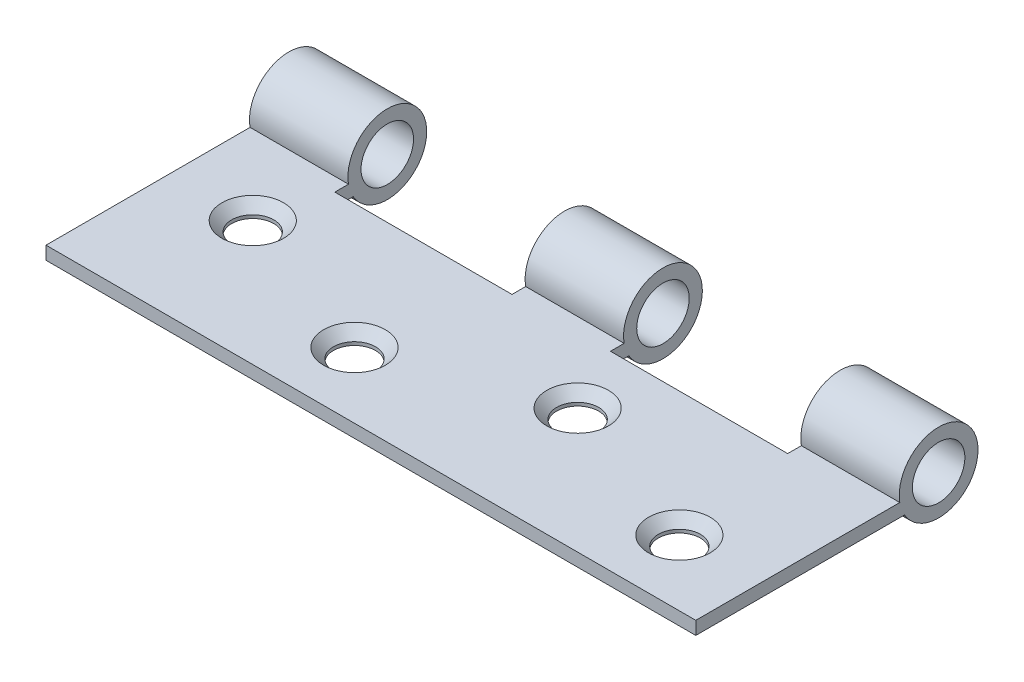
ISO-10303-21;
HEADER;
FILE_DESCRIPTION(('STEP AP214'),'2;1');
FILE_NAME('part.step','',(''),(''),'','','');
FILE_SCHEMA(('AUTOMOTIVE_DESIGN { 1 0 10303 214 1 1 1 1 }'));
ENDSEC;
DATA;
#1=APPLICATION_CONTEXT('core data for automotive mechanical design processes');
#2=APPLICATION_PROTOCOL_DEFINITION('international standard','automotive_design',2000,#1);
#3=PRODUCT_CONTEXT('',#1,'mechanical');
#4=PRODUCT('Part','Part','',(#3));
#5=PRODUCT_RELATED_PRODUCT_CATEGORY('part','',(#4));
#6=PRODUCT_DEFINITION_FORMATION('','',#4);
#7=PRODUCT_DEFINITION_CONTEXT('part definition',#1,'design');
#8=PRODUCT_DEFINITION('design','',#6,#7);
#9=PRODUCT_DEFINITION_SHAPE('','',#8);
#10=(LENGTH_UNIT() NAMED_UNIT(*) SI_UNIT(.MILLI.,.METRE.));
#11=(NAMED_UNIT(*) PLANE_ANGLE_UNIT() SI_UNIT($,.RADIAN.));
#12=(NAMED_UNIT(*) SI_UNIT($,.STERADIAN.) SOLID_ANGLE_UNIT());
#13=UNCERTAINTY_MEASURE_WITH_UNIT(LENGTH_MEASURE(1.E-05),#10,'distance_accuracy_value','');
#14=(GEOMETRIC_REPRESENTATION_CONTEXT(3) GLOBAL_UNCERTAINTY_ASSIGNED_CONTEXT((#13)) GLOBAL_UNIT_ASSIGNED_CONTEXT((#10,
#11,#12)) REPRESENTATION_CONTEXT('',''));
#15=CARTESIAN_POINT('',(0.,0.,0.));
#16=DIRECTION('',(0.,0.,1.));
#17=DIRECTION('',(1.,0.,0.));
#18=AXIS2_PLACEMENT_3D('',#15,#16,#17);
#19=CARTESIAN_POINT('',(99.,0.,0.));
#20=DIRECTION('',(-1.,0.,0.));
#21=DIRECTION('',(0.,0.,1.));
#22=AXIS2_PLACEMENT_3D('',#19,#20,#21);
#23=CYLINDRICAL_SURFACE('',#22,4.);
#24=CARTESIAN_POINT('',(84.,0.,0.));
#25=DIRECTION('',(1.,0.,0.));
#26=DIRECTION('',(0.,0.,-1.));
#27=AXIS2_PLACEMENT_3D('',#24,#25,#26);
#28=CIRCLE('',#27,4.);
#29=CARTESIAN_POINT('',(84.,0.,-4.));
#30=VERTEX_POINT('',#29);
#31=EDGE_CURVE('E153',#30,#30,#28,.T.);
#32=ORIENTED_EDGE('',*,*,#31,.F.);
#33=EDGE_LOOP('',(#32));
#34=FACE_BOUND('',#33,.T.);
#35=CARTESIAN_POINT('',(99.,0.,0.));
#36=DIRECTION('',(1.,0.,0.));
#37=DIRECTION('',(0.,0.,-1.));
#38=AXIS2_PLACEMENT_3D('',#35,#36,#37);
#39=CIRCLE('',#38,4.);
#40=CARTESIAN_POINT('',(99.,0.,-4.));
#41=VERTEX_POINT('',#40);
#42=EDGE_CURVE('E209',#41,#41,#39,.T.);
#43=ORIENTED_EDGE('',*,*,#42,.T.);
#44=EDGE_LOOP('',(#43));
#45=FACE_BOUND('',#44,.T.);
#46=ADVANCED_FACE('F33',(#34,#45),#23,.F.);
#47=CARTESIAN_POINT('',(99.,0.,0.));
#48=DIRECTION('',(-1.,0.,0.));
#49=DIRECTION('',(0.,0.,1.));
#50=AXIS2_PLACEMENT_3D('',#47,#48,#49);
#51=CYLINDRICAL_SURFACE('',#50,6.);
#52=CARTESIAN_POINT('',(57.,0.,0.));
#53=DIRECTION('',(-1.,0.,0.));
#54=DIRECTION('',(0.,0.,1.));
#55=AXIS2_PLACEMENT_3D('',#52,#53,#54);
#56=CIRCLE('',#55,6.);
#57=CARTESIAN_POINT('',(57.,-1.,5.91607978309962));
#58=VERTEX_POINT('',#57);
#59=CARTESIAN_POINT('',(57.,-3.00000000000001,5.19615242270663));
#60=VERTEX_POINT('',#59);
#61=EDGE_CURVE('E124',#58,#60,#56,.T.);
#62=ORIENTED_EDGE('',*,*,#61,.T.);
#63=DIRECTION('',(-1.,0.,0.));
#64=VECTOR('',#63,1.);
#65=CARTESIAN_POINT('',(99.,-3.,5.19615242270663));
#66=LINE('',#65,#64);
#67=CARTESIAN_POINT('',(42.,-3.00000000000001,5.19615242270663));
#68=VERTEX_POINT('',#67);
#69=EDGE_CURVE('E204',#68,#60,#66,.F.);
#70=ORIENTED_EDGE('',*,*,#69,.F.);
#71=CARTESIAN_POINT('',(42.,0.,0.));
#72=DIRECTION('',(1.,0.,0.));
#73=DIRECTION('',(0.,0.,-1.));
#74=AXIS2_PLACEMENT_3D('',#71,#72,#73);
#75=CIRCLE('',#74,6.);
#76=CARTESIAN_POINT('',(42.,-1.,5.91607978309962));
#77=VERTEX_POINT('',#76);
#78=EDGE_CURVE('E171',#68,#77,#75,.T.);
#79=ORIENTED_EDGE('',*,*,#78,.T.);
#80=DIRECTION('',(-1.,0.,0.));
#81=VECTOR('',#80,1.);
#82=CARTESIAN_POINT('',(99.,-1.,5.91607978309962));
#83=LINE('',#82,#81);
#84=EDGE_CURVE('E208',#58,#77,#83,.T.);
#85=ORIENTED_EDGE('',*,*,#84,.F.);
#86=EDGE_LOOP('',(#62,#70,#79,#85));
#87=FACE_BOUND('',#86,.T.);
#88=ADVANCED_FACE('F278',(#87),#51,.T.);
#89=CARTESIAN_POINT('',(15.,0.,0.));
#90=DIRECTION('',(-1.,0.,0.));
#91=DIRECTION('',(0.,0.,1.));
#92=AXIS2_PLACEMENT_3D('',#89,#90,#91);
#93=CIRCLE('',#92,6.);
#94=CARTESIAN_POINT('',(15.,-1.,5.91607978309962));
#95=VERTEX_POINT('',#94);
#96=CARTESIAN_POINT('',(15.,-3.00000000000001,5.19615242270663));
#97=VERTEX_POINT('',#96);
#98=EDGE_CURVE('E159',#95,#97,#93,.T.);
#99=ORIENTED_EDGE('',*,*,#98,.T.);
#100=CARTESIAN_POINT('',(0.,-3.00000000000001,5.19615242270663));
#101=VERTEX_POINT('',#100);
#102=EDGE_CURVE('E200',#101,#97,#66,.F.);
#103=ORIENTED_EDGE('',*,*,#102,.F.);
#104=CARTESIAN_POINT('',(0.,0.,0.));
#105=DIRECTION('',(1.,0.,0.));
#106=DIRECTION('',(0.,0.,-1.));
#107=AXIS2_PLACEMENT_3D('',#104,#105,#106);
#108=CIRCLE('',#107,6.);
#109=CARTESIAN_POINT('',(0.,-1.,5.91607978309962));
#110=VERTEX_POINT('',#109);
#111=EDGE_CURVE('E212',#101,#110,#108,.T.);
#112=ORIENTED_EDGE('',*,*,#111,.T.);
#113=EDGE_CURVE('E203',#95,#110,#83,.T.);
#114=ORIENTED_EDGE('',*,*,#113,.F.);
#115=EDGE_LOOP('',(#99,#103,#112,#114));
#116=FACE_BOUND('',#115,.T.);
#117=ADVANCED_FACE('F286',(#116),#51,.T.);
#118=CARTESIAN_POINT('',(57.,0.,0.));
#119=DIRECTION('',(-1.,0.,0.));
#120=DIRECTION('',(0.,0.,1.));
#121=AXIS2_PLACEMENT_3D('',#118,#119,#120);
#122=CIRCLE('',#121,4.);
#123=CARTESIAN_POINT('',(57.,0.,4.));
#124=VERTEX_POINT('',#123);
#125=EDGE_CURVE('E128',#124,#124,#122,.T.);
#126=ORIENTED_EDGE('',*,*,#125,.F.);
#127=EDGE_LOOP('',(#126));
#128=FACE_BOUND('',#127,.T.);
#129=CARTESIAN_POINT('',(42.,0.,0.));
#130=DIRECTION('',(1.,0.,0.));
#131=DIRECTION('',(0.,0.,-1.));
#132=AXIS2_PLACEMENT_3D('',#129,#130,#131);
#133=CIRCLE('',#132,4.);
#134=CARTESIAN_POINT('',(42.,0.,-4.));
#135=VERTEX_POINT('',#134);
#136=EDGE_CURVE('E177',#135,#135,#133,.T.);
#137=ORIENTED_EDGE('',*,*,#136,.F.);
#138=EDGE_LOOP('',(#137));
#139=FACE_BOUND('',#138,.T.);
#140=ADVANCED_FACE('F281',(#128,#139),#23,.F.);
#141=CARTESIAN_POINT('',(84.,-3.,5.19615242270663));
#142=VERTEX_POINT('',#141);
#143=CARTESIAN_POINT('',(99.,-3.,5.19615242270663));
#144=VERTEX_POINT('',#143);
#145=EDGE_CURVE('E199',#142,#144,#66,.F.);
#146=ORIENTED_EDGE('',*,*,#145,.F.);
#147=CARTESIAN_POINT('',(84.,0.,0.));
#148=DIRECTION('',(1.,0.,0.));
#149=DIRECTION('',(0.,0.,-1.));
#150=AXIS2_PLACEMENT_3D('',#147,#148,#149);
#151=CIRCLE('',#150,6.);
#152=CARTESIAN_POINT('',(84.,-1.,5.91607978309962));
#153=VERTEX_POINT('',#152);
#154=EDGE_CURVE('E145',#142,#153,#151,.T.);
#155=ORIENTED_EDGE('',*,*,#154,.T.);
#156=CARTESIAN_POINT('',(99.,-1.,5.91607978309962));
#157=VERTEX_POINT('',#156);
#158=EDGE_CURVE('E205',#157,#153,#83,.T.);
#159=ORIENTED_EDGE('',*,*,#158,.F.);
#160=CARTESIAN_POINT('',(99.,0.,0.));
#161=DIRECTION('',(1.,0.,0.));
#162=DIRECTION('',(0.,0.,-1.));
#163=AXIS2_PLACEMENT_3D('',#160,#161,#162);
#164=CIRCLE('',#163,6.);
#165=EDGE_CURVE('E215',#144,#157,#164,.T.);
#166=ORIENTED_EDGE('',*,*,#165,.F.);
#167=EDGE_LOOP('',(#146,#155,#159,#166));
#168=FACE_BOUND('',#167,.T.);
#169=ADVANCED_FACE('F289',(#168),#51,.T.);
#170=CARTESIAN_POINT('',(15.,0.,0.));
#171=DIRECTION('',(-1.,0.,0.));
#172=DIRECTION('',(0.,0.,1.));
#173=AXIS2_PLACEMENT_3D('',#170,#171,#172);
#174=CIRCLE('',#173,4.);
#175=CARTESIAN_POINT('',(15.,0.,4.));
#176=VERTEX_POINT('',#175);
#177=EDGE_CURVE('E165',#176,#176,#174,.T.);
#178=ORIENTED_EDGE('',*,*,#177,.F.);
#179=EDGE_LOOP('',(#178));
#180=FACE_BOUND('',#179,.T.);
#181=CARTESIAN_POINT('',(0.,0.,0.));
#182=DIRECTION('',(1.,0.,0.));
#183=DIRECTION('',(0.,0.,-1.));
#184=AXIS2_PLACEMENT_3D('',#181,#182,#183);
#185=CIRCLE('',#184,4.);
#186=CARTESIAN_POINT('',(0.,0.,-4.));
#187=VERTEX_POINT('',#186);
#188=EDGE_CURVE('E207',#187,#187,#185,.T.);
#189=ORIENTED_EDGE('',*,*,#188,.F.);
#190=EDGE_LOOP('',(#189));
#191=FACE_BOUND('',#190,.T.);
#192=ADVANCED_FACE('F282',(#180,#191),#23,.F.);
#193=CARTESIAN_POINT('',(99.,0.,0.));
#194=DIRECTION('',(1.,0.,0.));
#195=DIRECTION('',(0.,0.,-1.));
#196=AXIS2_PLACEMENT_3D('',#193,#194,#195);
#197=PLANE('',#196);
#198=ORIENTED_EDGE('',*,*,#42,.F.);
#199=EDGE_LOOP('',(#198));
#200=FACE_BOUND('',#199,.T.);
#201=ORIENTED_EDGE('',*,*,#165,.T.);
#202=DIRECTION('',(0.,0.,-1.));
#203=VECTOR('',#202,1.);
#204=CARTESIAN_POINT('',(99.,-1.,37.));
#205=LINE('',#204,#203);
#206=CARTESIAN_POINT('',(99.,-1.,37.));
#207=VERTEX_POINT('',#206);
#208=EDGE_CURVE('E189',#207,#157,#205,.T.);
#209=ORIENTED_EDGE('',*,*,#208,.F.);
#210=DIRECTION('',(0.,1.,0.));
#211=VECTOR('',#210,1.);
#212=CARTESIAN_POINT('',(99.,-1.,37.));
#213=LINE('',#212,#211);
#214=CARTESIAN_POINT('',(99.,-3.,37.));
#215=VERTEX_POINT('',#214);
#216=EDGE_CURVE('E187',#215,#207,#213,.T.);
#217=ORIENTED_EDGE('',*,*,#216,.F.);
#218=DIRECTION('',(0.,0.,-1.));
#219=VECTOR('',#218,1.);
#220=CARTESIAN_POINT('',(99.,-3.,37.));
#221=LINE('',#220,#219);
#222=EDGE_CURVE('E191',#215,#144,#221,.T.);
#223=ORIENTED_EDGE('',*,*,#222,.T.);
#224=EDGE_LOOP('',(#201,#209,#217,#223));
#225=FACE_BOUND('',#224,.T.);
#226=ADVANCED_FACE('F296',(#200,#225),#197,.T.);
#227=CARTESIAN_POINT('',(0.,0.,0.));
#228=DIRECTION('',(1.,0.,0.));
#229=DIRECTION('',(0.,0.,-1.));
#230=AXIS2_PLACEMENT_3D('',#227,#228,#229);
#231=PLANE('',#230);
#232=ORIENTED_EDGE('',*,*,#188,.T.);
#233=EDGE_LOOP('',(#232));
#234=FACE_BOUND('',#233,.T.);
#235=DIRECTION('',(0.,0.,-1.));
#236=VECTOR('',#235,1.);
#237=CARTESIAN_POINT('',(0.,-1.,37.));
#238=LINE('',#237,#236);
#239=CARTESIAN_POINT('',(0.,-1.,37.));
#240=VERTEX_POINT('',#239);
#241=EDGE_CURVE('E196',#240,#110,#238,.T.);
#242=ORIENTED_EDGE('',*,*,#241,.T.);
#243=ORIENTED_EDGE('',*,*,#111,.F.);
#244=DIRECTION('',(0.,0.,-1.));
#245=VECTOR('',#244,1.);
#246=CARTESIAN_POINT('',(0.,-3.00000000000001,37.));
#247=LINE('',#246,#245);
#248=CARTESIAN_POINT('',(0.,-3.00000000000001,37.));
#249=VERTEX_POINT('',#248);
#250=EDGE_CURVE('E194',#249,#101,#247,.T.);
#251=ORIENTED_EDGE('',*,*,#250,.F.);
#252=DIRECTION('',(0.,-1.,0.));
#253=VECTOR('',#252,1.);
#254=CARTESIAN_POINT('',(0.,-1.,37.));
#255=LINE('',#254,#253);
#256=EDGE_CURVE('E183',#240,#249,#255,.T.);
#257=ORIENTED_EDGE('',*,*,#256,.F.);
#258=EDGE_LOOP('',(#242,#243,#251,#257));
#259=FACE_BOUND('',#258,.T.);
#260=ADVANCED_FACE('F267',(#234,#259),#231,.F.);
#261=CARTESIAN_POINT('',(0.,-1.,37.));
#262=DIRECTION('',(0.,-1.,0.));
#263=DIRECTION('',(0.,0.,-1.));
#264=AXIS2_PLACEMENT_3D('',#261,#262,#263);
#265=PLANE('',#264);
#266=CARTESIAN_POINT('',(86.5,-1.,27.));
#267=DIRECTION('',(0.,-1.,0.));
#268=DIRECTION('',(0.,0.,-1.));
#269=AXIS2_PLACEMENT_3D('',#266,#267,#268);
#270=CIRCLE('',#269,4.69999999999997);
#271=CARTESIAN_POINT('',(86.5,-1.,22.3));
#272=VERTEX_POINT('',#271);
#273=EDGE_CURVE('E244',#272,#272,#270,.T.);
#274=ORIENTED_EDGE('',*,*,#273,.T.);
#275=EDGE_LOOP('',(#274));
#276=FACE_BOUND('',#275,.T.);
#277=CARTESIAN_POINT('',(62.,-1.,18.));
#278=DIRECTION('',(0.,-1.,0.));
#279=DIRECTION('',(0.,0.,-1.));
#280=AXIS2_PLACEMENT_3D('',#277,#278,#279);
#281=CIRCLE('',#280,4.69999999999996);
#282=CARTESIAN_POINT('',(62.,-1.,13.3));
#283=VERTEX_POINT('',#282);
#284=EDGE_CURVE('E241',#283,#283,#281,.T.);
#285=ORIENTED_EDGE('',*,*,#284,.T.);
#286=EDGE_LOOP('',(#285));
#287=FACE_BOUND('',#286,.T.);
#288=CARTESIAN_POINT('',(37.,-1.,27.));
#289=DIRECTION('',(0.,-1.,0.));
#290=DIRECTION('',(0.,0.,-1.));
#291=AXIS2_PLACEMENT_3D('',#288,#289,#290);
#292=CIRCLE('',#291,4.69999999999997);
#293=CARTESIAN_POINT('',(37.,-1.,22.3));
#294=VERTEX_POINT('',#293);
#295=EDGE_CURVE('E238',#294,#294,#292,.T.);
#296=ORIENTED_EDGE('',*,*,#295,.T.);
#297=EDGE_LOOP('',(#296));
#298=FACE_BOUND('',#297,.T.);
#299=CARTESIAN_POINT('',(12.5,-1.,18.));
#300=DIRECTION('',(0.,-1.,0.));
#301=DIRECTION('',(0.,0.,-1.));
#302=AXIS2_PLACEMENT_3D('',#299,#300,#301);
#303=CIRCLE('',#302,4.69999999999997);
#304=CARTESIAN_POINT('',(12.5,-1.,13.3));
#305=VERTEX_POINT('',#304);
#306=EDGE_CURVE('E235',#305,#305,#303,.T.);
#307=ORIENTED_EDGE('',*,*,#306,.T.);
#308=EDGE_LOOP('',(#307));
#309=FACE_BOUND('',#308,.T.);
#310=ORIENTED_EDGE('',*,*,#158,.T.);
#311=DIRECTION('',(0.,0.,1.));
#312=VECTOR('',#311,1.);
#313=CARTESIAN_POINT('',(84.,-1.,37.));
#314=LINE('',#313,#312);
#315=CARTESIAN_POINT('',(84.,-1.,8.));
#316=VERTEX_POINT('',#315);
#317=EDGE_CURVE('E144',#153,#316,#314,.T.);
#318=ORIENTED_EDGE('',*,*,#317,.T.);
#319=DIRECTION('',(-1.,0.,0.));
#320=VECTOR('',#319,1.);
#321=CARTESIAN_POINT('',(0.,-1.,8.));
#322=LINE('',#321,#320);
#323=CARTESIAN_POINT('',(57.,-1.,8.));
#324=VERTEX_POINT('',#323);
#325=EDGE_CURVE('E133',#316,#324,#322,.T.);
#326=ORIENTED_EDGE('',*,*,#325,.T.);
#327=DIRECTION('',(0.,0.,-1.));
#328=VECTOR('',#327,1.);
#329=CARTESIAN_POINT('',(57.,-1.,37.));
#330=LINE('',#329,#328);
#331=EDGE_CURVE('E122',#324,#58,#330,.T.);
#332=ORIENTED_EDGE('',*,*,#331,.T.);
#333=ORIENTED_EDGE('',*,*,#84,.T.);
#334=DIRECTION('',(0.,0.,1.));
#335=VECTOR('',#334,1.);
#336=CARTESIAN_POINT('',(42.,-1.,37.));
#337=LINE('',#336,#335);
#338=CARTESIAN_POINT('',(42.,-1.,8.));
#339=VERTEX_POINT('',#338);
#340=EDGE_CURVE('E174',#77,#339,#337,.T.);
#341=ORIENTED_EDGE('',*,*,#340,.T.);
#342=DIRECTION('',(-1.,0.,0.));
#343=VECTOR('',#342,1.);
#344=CARTESIAN_POINT('',(0.,-1.,8.));
#345=LINE('',#344,#343);
#346=CARTESIAN_POINT('',(15.,-1.,8.));
#347=VERTEX_POINT('',#346);
#348=EDGE_CURVE('E168',#339,#347,#345,.T.);
#349=ORIENTED_EDGE('',*,*,#348,.T.);
#350=DIRECTION('',(0.,0.,-1.));
#351=VECTOR('',#350,1.);
#352=CARTESIAN_POINT('',(15.,-1.,37.));
#353=LINE('',#352,#351);
#354=EDGE_CURVE('E162',#347,#95,#353,.T.);
#355=ORIENTED_EDGE('',*,*,#354,.T.);
#356=ORIENTED_EDGE('',*,*,#113,.T.);
#357=ORIENTED_EDGE('',*,*,#241,.F.);
#358=DIRECTION('',(-1.,0.,0.));
#359=VECTOR('',#358,1.);
#360=CARTESIAN_POINT('',(0.,-1.,37.));
#361=LINE('',#360,#359);
#362=EDGE_CURVE('E180',#207,#240,#361,.T.);
#363=ORIENTED_EDGE('',*,*,#362,.F.);
#364=ORIENTED_EDGE('',*,*,#208,.T.);
#365=EDGE_LOOP('',(#310,#318,#326,#332,#333,#341,#349,#355,#356,#357,#363,#364));
#366=FACE_BOUND('',#365,.T.);
#367=ADVANCED_FACE('F143',(#276,#287,#298,#309,#366),#265,.F.);
#368=CARTESIAN_POINT('',(99.,-3.,37.));
#369=DIRECTION('',(0.,1.,0.));
#370=DIRECTION('',(-1.,0.,0.));
#371=AXIS2_PLACEMENT_3D('',#368,#369,#370);
#372=PLANE('',#371);
#373=CARTESIAN_POINT('',(37.,-3.00000000000001,27.));
#374=DIRECTION('',(0.,-1.,0.));
#375=DIRECTION('',(1.,0.,0.));
#376=AXIS2_PLACEMENT_3D('',#373,#374,#375);
#377=CIRCLE('',#376,3.2);
#378=CARTESIAN_POINT('',(40.2,-3.00000000000001,27.));
#379=VERTEX_POINT('',#378);
#380=EDGE_CURVE('E338',#379,#379,#377,.T.);
#381=ORIENTED_EDGE('',*,*,#380,.F.);
#382=EDGE_LOOP('',(#381));
#383=FACE_BOUND('',#382,.T.);
#384=CARTESIAN_POINT('',(62.,-3.,18.));
#385=DIRECTION('',(0.,-1.,0.));
#386=DIRECTION('',(1.,0.,0.));
#387=AXIS2_PLACEMENT_3D('',#384,#385,#386);
#388=CIRCLE('',#387,3.2);
#389=CARTESIAN_POINT('',(65.2,-3.,18.));
#390=VERTEX_POINT('',#389);
#391=EDGE_CURVE('E342',#390,#390,#388,.T.);
#392=ORIENTED_EDGE('',*,*,#391,.F.);
#393=EDGE_LOOP('',(#392));
#394=FACE_BOUND('',#393,.T.);
#395=CARTESIAN_POINT('',(86.5,-3.,27.));
#396=DIRECTION('',(0.,-1.,0.));
#397=DIRECTION('',(1.,0.,0.));
#398=AXIS2_PLACEMENT_3D('',#395,#396,#397);
#399=CIRCLE('',#398,3.2);
#400=CARTESIAN_POINT('',(89.7,-3.,27.));
#401=VERTEX_POINT('',#400);
#402=EDGE_CURVE('E339',#401,#401,#399,.T.);
#403=ORIENTED_EDGE('',*,*,#402,.F.);
#404=EDGE_LOOP('',(#403));
#405=FACE_BOUND('',#404,.T.);
#406=CARTESIAN_POINT('',(12.5,-3.00000000000001,18.));
#407=DIRECTION('',(0.,-1.,0.));
#408=DIRECTION('',(1.,0.,0.));
#409=AXIS2_PLACEMENT_3D('',#406,#407,#408);
#410=CIRCLE('',#409,3.2);
#411=CARTESIAN_POINT('',(15.7,-3.00000000000001,18.));
#412=VERTEX_POINT('',#411);
#413=EDGE_CURVE('E139',#412,#412,#410,.T.);
#414=ORIENTED_EDGE('',*,*,#413,.F.);
#415=EDGE_LOOP('',(#414));
#416=FACE_BOUND('',#415,.T.);
#417=DIRECTION('',(1.,0.,0.));
#418=VECTOR('',#417,1.);
#419=CARTESIAN_POINT('',(99.,-3.,8.));
#420=LINE('',#419,#418);
#421=CARTESIAN_POINT('',(57.,-3.00000000000001,8.));
#422=VERTEX_POINT('',#421);
#423=CARTESIAN_POINT('',(84.,-3.,8.));
#424=VERTEX_POINT('',#423);
#425=EDGE_CURVE('E136',#422,#424,#420,.T.);
#426=ORIENTED_EDGE('',*,*,#425,.T.);
#427=DIRECTION('',(0.,0.,-1.));
#428=VECTOR('',#427,1.);
#429=CARTESIAN_POINT('',(84.,-3.,37.));
#430=LINE('',#429,#428);
#431=EDGE_CURVE('E232',#424,#142,#430,.T.);
#432=ORIENTED_EDGE('',*,*,#431,.T.);
#433=ORIENTED_EDGE('',*,*,#145,.T.);
#434=ORIENTED_EDGE('',*,*,#222,.F.);
#435=DIRECTION('',(1.,0.,0.));
#436=VECTOR('',#435,1.);
#437=CARTESIAN_POINT('',(99.,-3.,37.));
#438=LINE('',#437,#436);
#439=EDGE_CURVE('E185',#249,#215,#438,.T.);
#440=ORIENTED_EDGE('',*,*,#439,.F.);
#441=ORIENTED_EDGE('',*,*,#250,.T.);
#442=ORIENTED_EDGE('',*,*,#102,.T.);
#443=DIRECTION('',(0.,0.,1.));
#444=VECTOR('',#443,1.);
#445=CARTESIAN_POINT('',(15.,-3.00000000000001,37.));
#446=LINE('',#445,#444);
#447=CARTESIAN_POINT('',(15.,-3.00000000000001,8.));
#448=VERTEX_POINT('',#447);
#449=EDGE_CURVE('E218',#97,#448,#446,.T.);
#450=ORIENTED_EDGE('',*,*,#449,.T.);
#451=DIRECTION('',(1.,0.,0.));
#452=VECTOR('',#451,1.);
#453=CARTESIAN_POINT('',(99.,-3.,8.));
#454=LINE('',#453,#452);
#455=CARTESIAN_POINT('',(42.,-3.00000000000001,8.));
#456=VERTEX_POINT('',#455);
#457=EDGE_CURVE('E223',#448,#456,#454,.T.);
#458=ORIENTED_EDGE('',*,*,#457,.T.);
#459=DIRECTION('',(0.,0.,-1.));
#460=VECTOR('',#459,1.);
#461=CARTESIAN_POINT('',(42.,-3.00000000000001,37.));
#462=LINE('',#461,#460);
#463=EDGE_CURVE('E226',#456,#68,#462,.T.);
#464=ORIENTED_EDGE('',*,*,#463,.T.);
#465=ORIENTED_EDGE('',*,*,#69,.T.);
#466=DIRECTION('',(0.,0.,1.));
#467=VECTOR('',#466,1.);
#468=CARTESIAN_POINT('',(57.,-3.00000000000001,37.));
#469=LINE('',#468,#467);
#470=EDGE_CURVE('E229',#60,#422,#469,.T.);
#471=ORIENTED_EDGE('',*,*,#470,.T.);
#472=EDGE_LOOP('',(#426,#432,#433,#434,#440,#441,#442,#450,#458,#464,#465,#471));
#473=FACE_BOUND('',#472,.T.);
#474=ADVANCED_FACE('F266',(#383,#394,#405,#416,#473),#372,.F.);
#475=CARTESIAN_POINT('',(0.,0.,37.));
#476=DIRECTION('',(0.,0.,-1.));
#477=DIRECTION('',(-1.,0.,0.));
#478=AXIS2_PLACEMENT_3D('',#475,#476,#477);
#479=PLANE('',#478);
#480=ORIENTED_EDGE('',*,*,#362,.T.);
#481=ORIENTED_EDGE('',*,*,#256,.T.);
#482=ORIENTED_EDGE('',*,*,#439,.T.);
#483=ORIENTED_EDGE('',*,*,#216,.T.);
#484=EDGE_LOOP('',(#480,#481,#482,#483));
#485=FACE_BOUND('',#484,.T.);
#486=ADVANCED_FACE('F323',(#485),#479,.F.);
#487=CARTESIAN_POINT('',(42.,-6.,8.));
#488=DIRECTION('',(1.,0.,0.));
#489=DIRECTION('',(0.,0.,-1.));
#490=AXIS2_PLACEMENT_3D('',#487,#488,#489);
#491=PLANE('',#490);
#492=ORIENTED_EDGE('',*,*,#136,.T.);
#493=EDGE_LOOP('',(#492));
#494=FACE_BOUND('',#493,.T.);
#495=ORIENTED_EDGE('',*,*,#78,.F.);
#496=ORIENTED_EDGE('',*,*,#463,.F.);
#497=DIRECTION('',(0.,1.,0.));
#498=VECTOR('',#497,1.);
#499=CARTESIAN_POINT('',(42.,-6.,8.));
#500=LINE('',#499,#498);
#501=EDGE_CURVE('E156',#456,#339,#500,.T.);
#502=ORIENTED_EDGE('',*,*,#501,.T.);
#503=ORIENTED_EDGE('',*,*,#340,.F.);
#504=EDGE_LOOP('',(#495,#496,#502,#503));
#505=FACE_BOUND('',#504,.T.);
#506=ADVANCED_FACE('F379',(#494,#505),#491,.F.);
#507=CARTESIAN_POINT('',(15.,-6.,8.));
#508=DIRECTION('',(0.,0.,1.));
#509=DIRECTION('',(1.,0.,0.));
#510=AXIS2_PLACEMENT_3D('',#507,#508,#509);
#511=PLANE('',#510);
#512=ORIENTED_EDGE('',*,*,#501,.F.);
#513=ORIENTED_EDGE('',*,*,#457,.F.);
#514=DIRECTION('',(0.,1.,0.));
#515=VECTOR('',#514,1.);
#516=CARTESIAN_POINT('',(15.,-6.,8.));
#517=LINE('',#516,#515);
#518=EDGE_CURVE('E56',#448,#347,#517,.T.);
#519=ORIENTED_EDGE('',*,*,#518,.T.);
#520=ORIENTED_EDGE('',*,*,#348,.F.);
#521=EDGE_LOOP('',(#512,#513,#519,#520));
#522=FACE_BOUND('',#521,.T.);
#523=ADVANCED_FACE('F382',(#522),#511,.F.);
#524=CARTESIAN_POINT('',(15.,-6.,-6.));
#525=DIRECTION('',(-1.,0.,0.));
#526=DIRECTION('',(0.,0.,1.));
#527=AXIS2_PLACEMENT_3D('',#524,#525,#526);
#528=PLANE('',#527);
#529=ORIENTED_EDGE('',*,*,#177,.T.);
#530=EDGE_LOOP('',(#529));
#531=FACE_BOUND('',#530,.T.);
#532=ORIENTED_EDGE('',*,*,#518,.F.);
#533=ORIENTED_EDGE('',*,*,#449,.F.);
#534=ORIENTED_EDGE('',*,*,#98,.F.);
#535=ORIENTED_EDGE('',*,*,#354,.F.);
#536=EDGE_LOOP('',(#532,#533,#534,#535));
#537=FACE_BOUND('',#536,.T.);
#538=ADVANCED_FACE('F375',(#531,#537),#528,.F.);
#539=CARTESIAN_POINT('',(84.,-6.,-6.));
#540=DIRECTION('',(1.,0.,0.));
#541=DIRECTION('',(0.,0.,-1.));
#542=AXIS2_PLACEMENT_3D('',#539,#540,#541);
#543=PLANE('',#542);
#544=ORIENTED_EDGE('',*,*,#31,.T.);
#545=EDGE_LOOP('',(#544));
#546=FACE_BOUND('',#545,.T.);
#547=ORIENTED_EDGE('',*,*,#154,.F.);
#548=ORIENTED_EDGE('',*,*,#431,.F.);
#549=DIRECTION('',(0.,1.,0.));
#550=VECTOR('',#549,1.);
#551=CARTESIAN_POINT('',(84.,-6.,8.));
#552=LINE('',#551,#550);
#553=EDGE_CURVE('E138',#424,#316,#552,.T.);
#554=ORIENTED_EDGE('',*,*,#553,.T.);
#555=ORIENTED_EDGE('',*,*,#317,.F.);
#556=EDGE_LOOP('',(#547,#548,#554,#555));
#557=FACE_BOUND('',#556,.T.);
#558=ADVANCED_FACE('F330',(#546,#557),#543,.F.);
#559=CARTESIAN_POINT('',(84.,-6.,8.));
#560=DIRECTION('',(0.,0.,1.));
#561=DIRECTION('',(1.,0.,0.));
#562=AXIS2_PLACEMENT_3D('',#559,#560,#561);
#563=PLANE('',#562);
#564=ORIENTED_EDGE('',*,*,#553,.F.);
#565=ORIENTED_EDGE('',*,*,#425,.F.);
#566=DIRECTION('',(0.,1.,0.));
#567=VECTOR('',#566,1.);
#568=CARTESIAN_POINT('',(57.,-6.,8.));
#569=LINE('',#568,#567);
#570=EDGE_CURVE('E48',#422,#324,#569,.T.);
#571=ORIENTED_EDGE('',*,*,#570,.T.);
#572=ORIENTED_EDGE('',*,*,#325,.F.);
#573=EDGE_LOOP('',(#564,#565,#571,#572));
#574=FACE_BOUND('',#573,.T.);
#575=ADVANCED_FACE('F132',(#574),#563,.F.);
#576=CARTESIAN_POINT('',(57.,-6.,8.));
#577=DIRECTION('',(-1.,0.,0.));
#578=DIRECTION('',(0.,0.,1.));
#579=AXIS2_PLACEMENT_3D('',#576,#577,#578);
#580=PLANE('',#579);
#581=ORIENTED_EDGE('',*,*,#125,.T.);
#582=EDGE_LOOP('',(#581));
#583=FACE_BOUND('',#582,.T.);
#584=ORIENTED_EDGE('',*,*,#570,.F.);
#585=ORIENTED_EDGE('',*,*,#470,.F.);
#586=ORIENTED_EDGE('',*,*,#61,.F.);
#587=ORIENTED_EDGE('',*,*,#331,.F.);
#588=EDGE_LOOP('',(#584,#585,#586,#587));
#589=FACE_BOUND('',#588,.T.);
#590=ADVANCED_FACE('F123',(#583,#589),#580,.F.);
#591=CARTESIAN_POINT('',(12.5,34.,18.));
#592=DIRECTION('',(0.,-1.,0.));
#593=DIRECTION('',(1.,0.,0.));
#594=AXIS2_PLACEMENT_3D('',#591,#592,#593);
#595=CYLINDRICAL_SURFACE('',#594,3.2);
#596=CARTESIAN_POINT('',(12.5,-2.49999999999997,18.));
#597=DIRECTION('',(0.,-1.,0.));
#598=DIRECTION('',(1.,0.,0.));
#599=AXIS2_PLACEMENT_3D('',#596,#597,#598);
#600=CIRCLE('',#599,3.2);
#601=CARTESIAN_POINT('',(15.7,-2.49999999999997,18.));
#602=VERTEX_POINT('',#601);
#603=EDGE_CURVE('E11',#602,#602,#600,.F.);
#604=ORIENTED_EDGE('',*,*,#603,.T.);
#605=EDGE_LOOP('',(#604));
#606=FACE_BOUND('',#605,.T.);
#607=ORIENTED_EDGE('',*,*,#413,.T.);
#608=EDGE_LOOP('',(#607));
#609=FACE_BOUND('',#608,.T.);
#610=ADVANCED_FACE('F357',(#606,#609),#595,.F.);
#611=CARTESIAN_POINT('',(86.5,34.,27.));
#612=DIRECTION('',(0.,-1.,0.));
#613=DIRECTION('',(1.,0.,0.));
#614=AXIS2_PLACEMENT_3D('',#611,#612,#613);
#615=CYLINDRICAL_SURFACE('',#614,3.2);
#616=CARTESIAN_POINT('',(86.5,-2.49999999999998,27.));
#617=DIRECTION('',(0.,-1.,0.));
#618=DIRECTION('',(0.,0.,-1.));
#619=AXIS2_PLACEMENT_3D('',#616,#617,#618);
#620=CIRCLE('',#619,3.2);
#621=CARTESIAN_POINT('',(86.5,-2.49999999999998,23.8));
#622=VERTEX_POINT('',#621);
#623=EDGE_CURVE('E247',#622,#622,#620,.F.);
#624=ORIENTED_EDGE('',*,*,#623,.T.);
#625=EDGE_LOOP('',(#624));
#626=FACE_BOUND('',#625,.T.);
#627=ORIENTED_EDGE('',*,*,#402,.T.);
#628=EDGE_LOOP('',(#627));
#629=FACE_BOUND('',#628,.T.);
#630=ADVANCED_FACE('F359',(#626,#629),#615,.F.);
#631=CARTESIAN_POINT('',(62.,34.,18.));
#632=DIRECTION('',(0.,-1.,0.));
#633=DIRECTION('',(1.,0.,0.));
#634=AXIS2_PLACEMENT_3D('',#631,#632,#633);
#635=CYLINDRICAL_SURFACE('',#634,3.2);
#636=CARTESIAN_POINT('',(62.,-2.49999999999997,18.));
#637=DIRECTION('',(0.,-1.,0.));
#638=DIRECTION('',(0.,0.,-1.));
#639=AXIS2_PLACEMENT_3D('',#636,#637,#638);
#640=CIRCLE('',#639,3.2);
#641=CARTESIAN_POINT('',(62.,-2.49999999999997,14.8));
#642=VERTEX_POINT('',#641);
#643=EDGE_CURVE('E250',#642,#642,#640,.F.);
#644=ORIENTED_EDGE('',*,*,#643,.T.);
#645=EDGE_LOOP('',(#644));
#646=FACE_BOUND('',#645,.T.);
#647=ORIENTED_EDGE('',*,*,#391,.T.);
#648=EDGE_LOOP('',(#647));
#649=FACE_BOUND('',#648,.T.);
#650=ADVANCED_FACE('F366',(#646,#649),#635,.F.);
#651=CARTESIAN_POINT('',(37.,34.,27.));
#652=DIRECTION('',(0.,-1.,0.));
#653=DIRECTION('',(1.,0.,0.));
#654=AXIS2_PLACEMENT_3D('',#651,#652,#653);
#655=CYLINDRICAL_SURFACE('',#654,3.2);
#656=CARTESIAN_POINT('',(37.,-2.49999999999997,27.));
#657=DIRECTION('',(0.,-1.,0.));
#658=DIRECTION('',(0.,0.,-1.));
#659=AXIS2_PLACEMENT_3D('',#656,#657,#658);
#660=CIRCLE('',#659,3.2);
#661=CARTESIAN_POINT('',(37.,-2.49999999999997,23.8));
#662=VERTEX_POINT('',#661);
#663=EDGE_CURVE('E41',#662,#662,#660,.F.);
#664=ORIENTED_EDGE('',*,*,#663,.T.);
#665=EDGE_LOOP('',(#664));
#666=FACE_BOUND('',#665,.T.);
#667=ORIENTED_EDGE('',*,*,#380,.T.);
#668=EDGE_LOOP('',(#667));
#669=FACE_BOUND('',#668,.T.);
#670=ADVANCED_FACE('F255',(#666,#669),#655,.F.);
#671=CARTESIAN_POINT('',(86.5,-1.,27.));
#672=DIRECTION('',(0.,1.,0.));
#673=DIRECTION('',(0.,0.,1.));
#674=AXIS2_PLACEMENT_3D('',#671,#672,#673);
#675=CONICAL_SURFACE('',#674,4.69999999999997,0.785398163397446);
#676=ORIENTED_EDGE('',*,*,#623,.F.);
#677=EDGE_LOOP('',(#676));
#678=FACE_BOUND('',#677,.T.);
#679=ORIENTED_EDGE('',*,*,#273,.F.);
#680=EDGE_LOOP('',(#679));
#681=FACE_BOUND('',#680,.T.);
#682=ADVANCED_FACE('F458',(#678,#681),#675,.F.);
#683=CARTESIAN_POINT('',(62.,-1.,18.));
#684=DIRECTION('',(0.,1.,0.));
#685=DIRECTION('',(0.,0.,1.));
#686=AXIS2_PLACEMENT_3D('',#683,#684,#685);
#687=CONICAL_SURFACE('',#686,4.69999999999996,0.785398163397444);
#688=ORIENTED_EDGE('',*,*,#643,.F.);
#689=EDGE_LOOP('',(#688));
#690=FACE_BOUND('',#689,.T.);
#691=ORIENTED_EDGE('',*,*,#284,.F.);
#692=EDGE_LOOP('',(#691));
#693=FACE_BOUND('',#692,.T.);
#694=ADVANCED_FACE('F261',(#690,#693),#687,.F.);
#695=CARTESIAN_POINT('',(37.,-1.,27.));
#696=DIRECTION('',(0.,1.,0.));
#697=DIRECTION('',(0.,0.,1.));
#698=AXIS2_PLACEMENT_3D('',#695,#696,#697);
#699=CONICAL_SURFACE('',#698,4.69999999999997,0.785398163397445);
#700=ORIENTED_EDGE('',*,*,#663,.F.);
#701=EDGE_LOOP('',(#700));
#702=FACE_BOUND('',#701,.T.);
#703=ORIENTED_EDGE('',*,*,#295,.F.);
#704=EDGE_LOOP('',(#703));
#705=FACE_BOUND('',#704,.T.);
#706=ADVANCED_FACE('F258',(#702,#705),#699,.F.);
#707=CARTESIAN_POINT('',(12.5,-1.,18.));
#708=DIRECTION('',(0.,1.,0.));
#709=DIRECTION('',(-1.,0.,0.));
#710=AXIS2_PLACEMENT_3D('',#707,#708,#709);
#711=CONICAL_SURFACE('',#710,4.69999999999997,0.785398163397446);
#712=ORIENTED_EDGE('',*,*,#603,.F.);
#713=EDGE_LOOP('',(#712));
#714=FACE_BOUND('',#713,.T.);
#715=ORIENTED_EDGE('',*,*,#306,.F.);
#716=EDGE_LOOP('',(#715));
#717=FACE_BOUND('',#716,.T.);
#718=ADVANCED_FACE('F35',(#714,#717),#711,.F.);
#719=CLOSED_SHELL('',(#46,#88,#117,#140,#169,#192,#226,#260,#367,#474,#486,#506,#523,#538,#558,
#575,#590,#610,#630,#650,#670,#682,#694,#706,#718));
#720=MANIFOLD_SOLID_BREP('B2',#719);
#721=ADVANCED_BREP_SHAPE_REPRESENTATION('',(#18,#720),#14);
#722=SHAPE_DEFINITION_REPRESENTATION(#9,#721);
ENDSEC;
END-ISO-10303-21;
